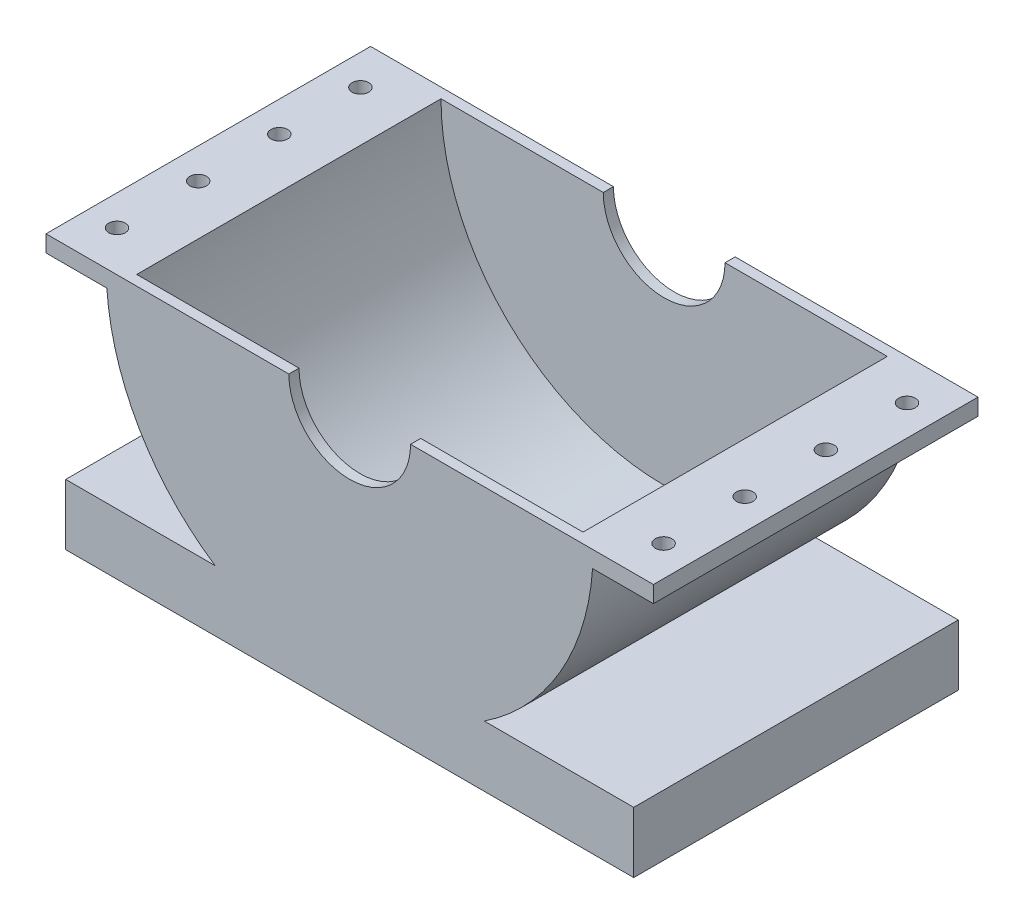
ISO-10303-21;
HEADER;
FILE_DESCRIPTION(('STEP AP214'),'2;1');
FILE_NAME('part.step','',(''),(''),'','','');
FILE_SCHEMA(('AUTOMOTIVE_DESIGN { 1 0 10303 214 1 1 1 1 }'));
ENDSEC;
DATA;
#1=APPLICATION_CONTEXT('core data for automotive mechanical design processes');
#2=APPLICATION_PROTOCOL_DEFINITION('international standard','automotive_design',2000,#1);
#3=PRODUCT_CONTEXT('',#1,'mechanical');
#4=PRODUCT('Part','Part','',(#3));
#5=PRODUCT_RELATED_PRODUCT_CATEGORY('part','',(#4));
#6=PRODUCT_DEFINITION_FORMATION('','',#4);
#7=PRODUCT_DEFINITION_CONTEXT('part definition',#1,'design');
#8=PRODUCT_DEFINITION('design','',#6,#7);
#9=PRODUCT_DEFINITION_SHAPE('','',#8);
#10=(LENGTH_UNIT() NAMED_UNIT(*) SI_UNIT(.MILLI.,.METRE.));
#11=(NAMED_UNIT(*) PLANE_ANGLE_UNIT() SI_UNIT($,.RADIAN.));
#12=(NAMED_UNIT(*) SI_UNIT($,.STERADIAN.) SOLID_ANGLE_UNIT());
#13=UNCERTAINTY_MEASURE_WITH_UNIT(LENGTH_MEASURE(1.E-05),#10,'distance_accuracy_value','');
#14=(GEOMETRIC_REPRESENTATION_CONTEXT(3) GLOBAL_UNCERTAINTY_ASSIGNED_CONTEXT((#13)) GLOBAL_UNIT_ASSIGNED_CONTEXT((#10,
#11,#12)) REPRESENTATION_CONTEXT('',''));
#15=CARTESIAN_POINT('',(0.,0.,0.));
#16=DIRECTION('',(0.,0.,1.));
#17=DIRECTION('',(1.,0.,0.));
#18=AXIS2_PLACEMENT_3D('',#15,#16,#17);
#19=CARTESIAN_POINT('',(-1.5,0.,4.));
#20=DIRECTION('',(0.,-1.,0.));
#21=DIRECTION('',(1.,0.,0.));
#22=AXIS2_PLACEMENT_3D('',#19,#20,#21);
#23=PLANE('',#22);
#24=CARTESIAN_POINT('',(-6.73597527559211,0.,1.));
#25=DIRECTION('',(0.,1.,0.));
#26=DIRECTION('',(0.,0.,1.));
#27=AXIS2_PLACEMENT_3D('',#24,#25,#26);
#28=CIRCLE('',#27,0.204999999999988);
#29=CARTESIAN_POINT('',(-6.73597527559211,0.,1.20499999999999));
#30=VERTEX_POINT('',#29);
#31=EDGE_CURVE('E468',#30,#30,#28,.T.);
#32=ORIENTED_EDGE('',*,*,#31,.F.);
#33=EDGE_LOOP('',(#32));
#34=FACE_BOUND('',#33,.T.);
#35=CARTESIAN_POINT('',(-6.73597527559211,0.,-1.));
#36=DIRECTION('',(0.,1.,0.));
#37=DIRECTION('',(0.,0.,1.));
#38=AXIS2_PLACEMENT_3D('',#35,#36,#37);
#39=CIRCLE('',#38,0.204999999999988);
#40=CARTESIAN_POINT('',(-6.73597527559211,0.,-0.795000000000012));
#41=VERTEX_POINT('',#40);
#42=EDGE_CURVE('E464',#41,#41,#39,.T.);
#43=ORIENTED_EDGE('',*,*,#42,.F.);
#44=EDGE_LOOP('',(#43));
#45=FACE_BOUND('',#44,.T.);
#46=CARTESIAN_POINT('',(-6.73597527559211,0.,-3.));
#47=DIRECTION('',(0.,1.,0.));
#48=DIRECTION('',(0.,0.,1.));
#49=AXIS2_PLACEMENT_3D('',#46,#47,#48);
#50=CIRCLE('',#49,0.204999999999988);
#51=CARTESIAN_POINT('',(-6.73597527559211,0.,-2.79500000000001));
#52=VERTEX_POINT('',#51);
#53=EDGE_CURVE('E460',#52,#52,#50,.T.);
#54=ORIENTED_EDGE('',*,*,#53,.F.);
#55=EDGE_LOOP('',(#54));
#56=FACE_BOUND('',#55,.T.);
#57=DIRECTION('',(0.,0.,-1.));
#58=VECTOR('',#57,1.);
#59=CARTESIAN_POINT('',(-1.5,0.,4.));
#60=LINE('',#59,#58);
#61=CARTESIAN_POINT('',(-1.5,0.,4.));
#62=VERTEX_POINT('',#61);
#63=CARTESIAN_POINT('',(-1.5,0.,3.75));
#64=VERTEX_POINT('',#63);
#65=EDGE_CURVE('E242',#62,#64,#60,.T.);
#66=ORIENTED_EDGE('',*,*,#65,.T.);
#67=DIRECTION('',(-1.,0.,0.));
#68=VECTOR('',#67,1.);
#69=CARTESIAN_POINT('',(-1.5,0.,3.75));
#70=LINE('',#69,#68);
#71=CARTESIAN_POINT('',(-5.5,0.,3.75));
#72=VERTEX_POINT('',#71);
#73=EDGE_CURVE('E431',#64,#72,#70,.T.);
#74=ORIENTED_EDGE('',*,*,#73,.T.);
#75=DIRECTION('',(0.,0.,-1.));
#76=VECTOR('',#75,1.);
#77=CARTESIAN_POINT('',(-5.5,0.,3.75));
#78=LINE('',#77,#76);
#79=CARTESIAN_POINT('',(-5.5,0.,-3.75));
#80=VERTEX_POINT('',#79);
#81=EDGE_CURVE('E183',#80,#72,#78,.F.);
#82=ORIENTED_EDGE('',*,*,#81,.F.);
#83=DIRECTION('',(-1.,0.,0.));
#84=VECTOR('',#83,1.);
#85=CARTESIAN_POINT('',(-1.5,0.,-3.75));
#86=LINE('',#85,#84);
#87=CARTESIAN_POINT('',(-1.5,0.,-3.75));
#88=VERTEX_POINT('',#87);
#89=EDGE_CURVE('E425',#88,#80,#86,.T.);
#90=ORIENTED_EDGE('',*,*,#89,.F.);
#91=CARTESIAN_POINT('',(-1.5,0.,-4.));
#92=VERTEX_POINT('',#91);
#93=EDGE_CURVE('E241',#88,#92,#60,.T.);
#94=ORIENTED_EDGE('',*,*,#93,.T.);
#95=DIRECTION('',(-1.,0.,0.));
#96=VECTOR('',#95,1.);
#97=CARTESIAN_POINT('',(-1.5,0.,-4.));
#98=LINE('',#97,#96);
#99=CARTESIAN_POINT('',(-7.48597527559211,0.,-4.));
#100=VERTEX_POINT('',#99);
#101=EDGE_CURVE('E182',#92,#100,#98,.T.);
#102=ORIENTED_EDGE('',*,*,#101,.T.);
#103=DIRECTION('',(0.,0.,-1.));
#104=VECTOR('',#103,1.);
#105=CARTESIAN_POINT('',(-7.48597527559211,0.,4.));
#106=LINE('',#105,#104);
#107=CARTESIAN_POINT('',(-7.48597527559211,0.,4.));
#108=VERTEX_POINT('',#107);
#109=EDGE_CURVE('E238',#108,#100,#106,.T.);
#110=ORIENTED_EDGE('',*,*,#109,.F.);
#111=DIRECTION('',(-1.,0.,0.));
#112=VECTOR('',#111,1.);
#113=CARTESIAN_POINT('',(-1.5,0.,4.));
#114=LINE('',#113,#112);
#115=EDGE_CURVE('E118',#62,#108,#114,.T.);
#116=ORIENTED_EDGE('',*,*,#115,.F.);
#117=EDGE_LOOP('',(#66,#74,#82,#90,#94,#102,#110,#116));
#118=FACE_BOUND('',#117,.T.);
#119=CARTESIAN_POINT('',(-6.73597527559211,0.,3.));
#120=DIRECTION('',(0.,1.,0.));
#121=DIRECTION('',(0.,0.,1.));
#122=AXIS2_PLACEMENT_3D('',#119,#120,#121);
#123=CIRCLE('',#122,0.204999999999988);
#124=CARTESIAN_POINT('',(-6.73597527559211,0.,3.20499999999999));
#125=VERTEX_POINT('',#124);
#126=EDGE_CURVE('E472',#125,#125,#123,.T.);
#127=ORIENTED_EDGE('',*,*,#126,.F.);
#128=EDGE_LOOP('',(#127));
#129=FACE_BOUND('',#128,.T.);
#130=ADVANCED_FACE('F33',(#34,#45,#56,#118,#129),#23,.F.);
#131=CARTESIAN_POINT('',(6.73597527559211,0.,3.));
#132=DIRECTION('',(0.,1.,0.));
#133=DIRECTION('',(0.,0.,1.));
#134=AXIS2_PLACEMENT_3D('',#131,#132,#133);
#135=CYLINDRICAL_SURFACE('',#134,0.204999999999994);
#136=CARTESIAN_POINT('',(6.73597527559211,-0.410000000000001,3.));
#137=DIRECTION('',(0.,1.,0.));
#138=DIRECTION('',(-1.,0.,0.));
#139=AXIS2_PLACEMENT_3D('',#136,#137,#138);
#140=CIRCLE('',#139,0.204999999999994);
#141=CARTESIAN_POINT('',(6.53097527559211,-0.410000000000001,3.));
#142=VERTEX_POINT('',#141);
#143=EDGE_CURVE('E41',#142,#142,#140,.T.);
#144=ORIENTED_EDGE('',*,*,#143,.F.);
#145=EDGE_LOOP('',(#144));
#146=FACE_BOUND('',#145,.T.);
#147=CARTESIAN_POINT('',(6.73597527559211,0.,3.));
#148=DIRECTION('',(0.,1.,0.));
#149=DIRECTION('',(0.,0.,1.));
#150=AXIS2_PLACEMENT_3D('',#147,#148,#149);
#151=CIRCLE('',#150,0.204999999999988);
#152=CARTESIAN_POINT('',(6.73597527559211,0.,3.20499999999999));
#153=VERTEX_POINT('',#152);
#154=EDGE_CURVE('E11',#153,#153,#151,.T.);
#155=ORIENTED_EDGE('',*,*,#154,.T.);
#156=EDGE_LOOP('',(#155));
#157=FACE_BOUND('',#156,.T.);
#158=ADVANCED_FACE('F35',(#146,#157),#135,.F.);
#159=CARTESIAN_POINT('',(6.73597527559211,0.,1.));
#160=DIRECTION('',(0.,1.,0.));
#161=DIRECTION('',(0.,0.,1.));
#162=AXIS2_PLACEMENT_3D('',#159,#160,#161);
#163=CYLINDRICAL_SURFACE('',#162,0.204999999999994);
#164=CARTESIAN_POINT('',(6.73597527559211,-0.410000000000001,1.));
#165=DIRECTION('',(0.,1.,0.));
#166=DIRECTION('',(-1.,0.,0.));
#167=AXIS2_PLACEMENT_3D('',#164,#165,#166);
#168=CIRCLE('',#167,0.204999999999994);
#169=CARTESIAN_POINT('',(6.53097527559211,-0.410000000000001,1.));
#170=VERTEX_POINT('',#169);
#171=EDGE_CURVE('E251',#170,#170,#168,.T.);
#172=ORIENTED_EDGE('',*,*,#171,.F.);
#173=EDGE_LOOP('',(#172));
#174=FACE_BOUND('',#173,.T.);
#175=CARTESIAN_POINT('',(6.73597527559211,0.,1.));
#176=DIRECTION('',(0.,1.,0.));
#177=DIRECTION('',(0.,0.,1.));
#178=AXIS2_PLACEMENT_3D('',#175,#176,#177);
#179=CIRCLE('',#178,0.204999999999988);
#180=CARTESIAN_POINT('',(6.73597527559211,0.,1.20499999999999));
#181=VERTEX_POINT('',#180);
#182=EDGE_CURVE('E254',#181,#181,#179,.T.);
#183=ORIENTED_EDGE('',*,*,#182,.T.);
#184=EDGE_LOOP('',(#183));
#185=FACE_BOUND('',#184,.T.);
#186=ADVANCED_FACE('F262',(#174,#185),#163,.F.);
#187=CARTESIAN_POINT('',(0.,0.,4.));
#188=DIRECTION('',(0.,0.,-1.));
#189=DIRECTION('',(-1.,0.,0.));
#190=AXIS2_PLACEMENT_3D('',#187,#188,#189);
#191=CYLINDRICAL_SURFACE('',#190,1.5);
#192=CARTESIAN_POINT('',(0.,0.,-3.75));
#193=DIRECTION('',(0.,0.,1.));
#194=DIRECTION('',(1.,0.,0.));
#195=AXIS2_PLACEMENT_3D('',#192,#193,#194);
#196=CIRCLE('',#195,1.5);
#197=CARTESIAN_POINT('',(1.5,0.,-3.75));
#198=VERTEX_POINT('',#197);
#199=EDGE_CURVE('E419',#198,#88,#196,.F.);
#200=ORIENTED_EDGE('',*,*,#199,.F.);
#201=DIRECTION('',(0.,0.,-1.));
#202=VECTOR('',#201,1.);
#203=CARTESIAN_POINT('',(1.5,0.,4.));
#204=LINE('',#203,#202);
#205=CARTESIAN_POINT('',(1.5,0.,-4.));
#206=VERTEX_POINT('',#205);
#207=EDGE_CURVE('E109',#198,#206,#204,.T.);
#208=ORIENTED_EDGE('',*,*,#207,.T.);
#209=CARTESIAN_POINT('',(0.,0.,-4.));
#210=DIRECTION('',(0.,0.,-1.));
#211=DIRECTION('',(1.,0.,0.));
#212=AXIS2_PLACEMENT_3D('',#209,#210,#211);
#213=CIRCLE('',#212,1.5);
#214=EDGE_CURVE('E180',#206,#92,#213,.T.);
#215=ORIENTED_EDGE('',*,*,#214,.T.);
#216=ORIENTED_EDGE('',*,*,#93,.F.);
#217=EDGE_LOOP('',(#200,#208,#215,#216));
#218=FACE_BOUND('',#217,.T.);
#219=ADVANCED_FACE('F292',(#218),#191,.F.);
#220=CARTESIAN_POINT('',(1.5,0.,4.));
#221=VERTEX_POINT('',#220);
#222=CARTESIAN_POINT('',(1.5,0.,3.75));
#223=VERTEX_POINT('',#222);
#224=EDGE_CURVE('E209',#221,#223,#204,.T.);
#225=ORIENTED_EDGE('',*,*,#224,.T.);
#226=CARTESIAN_POINT('',(0.,0.,3.75));
#227=DIRECTION('',(0.,0.,1.));
#228=DIRECTION('',(1.,0.,0.));
#229=AXIS2_PLACEMENT_3D('',#226,#227,#228);
#230=CIRCLE('',#229,1.5);
#231=EDGE_CURVE('E429',#223,#64,#230,.F.);
#232=ORIENTED_EDGE('',*,*,#231,.T.);
#233=ORIENTED_EDGE('',*,*,#65,.F.);
#234=CARTESIAN_POINT('',(0.,0.,4.));
#235=DIRECTION('',(0.,0.,-1.));
#236=DIRECTION('',(1.,0.,0.));
#237=AXIS2_PLACEMENT_3D('',#234,#235,#236);
#238=CIRCLE('',#237,1.5);
#239=EDGE_CURVE('E208',#221,#62,#238,.T.);
#240=ORIENTED_EDGE('',*,*,#239,.F.);
#241=EDGE_LOOP('',(#225,#232,#233,#240));
#242=FACE_BOUND('',#241,.T.);
#243=ADVANCED_FACE('F290',(#242),#191,.F.);
#244=CARTESIAN_POINT('',(-7.48597527559211,0.,4.));
#245=DIRECTION('',(1.,0.,0.));
#246=DIRECTION('',(0.,0.,-1.));
#247=AXIS2_PLACEMENT_3D('',#244,#245,#246);
#248=PLANE('',#247);
#249=DIRECTION('',(0.,-1.,0.));
#250=VECTOR('',#249,1.);
#251=CARTESIAN_POINT('',(-7.48597527559211,0.,-4.));
#252=LINE('',#251,#250);
#253=CARTESIAN_POINT('',(-7.48597527559211,-0.410000000000001,-4.));
#254=VERTEX_POINT('',#253);
#255=EDGE_CURVE('E185',#100,#254,#252,.T.);
#256=ORIENTED_EDGE('',*,*,#255,.T.);
#257=DIRECTION('',(0.,0.,-1.));
#258=VECTOR('',#257,1.);
#259=CARTESIAN_POINT('',(-7.48597527559211,-0.410000000000001,4.));
#260=LINE('',#259,#258);
#261=CARTESIAN_POINT('',(-7.48597527559211,-0.410000000000001,4.));
#262=VERTEX_POINT('',#261);
#263=EDGE_CURVE('E235',#262,#254,#260,.T.);
#264=ORIENTED_EDGE('',*,*,#263,.F.);
#265=DIRECTION('',(0.,-1.,0.));
#266=VECTOR('',#265,1.);
#267=CARTESIAN_POINT('',(-7.48597527559211,0.,4.));
#268=LINE('',#267,#266);
#269=EDGE_CURVE('E406',#108,#262,#268,.T.);
#270=ORIENTED_EDGE('',*,*,#269,.F.);
#271=ORIENTED_EDGE('',*,*,#109,.T.);
#272=EDGE_LOOP('',(#256,#264,#270,#271));
#273=FACE_BOUND('',#272,.T.);
#274=ADVANCED_FACE('F288',(#273),#248,.F.);
#275=CARTESIAN_POINT('',(-7.48597527559211,-0.410000000000001,4.));
#276=DIRECTION('',(0.,1.,0.));
#277=DIRECTION('',(-1.,0.,0.));
#278=AXIS2_PLACEMENT_3D('',#275,#276,#277);
#279=PLANE('',#278);
#280=CARTESIAN_POINT('',(-6.73597527559211,-0.410000000000001,3.));
#281=DIRECTION('',(0.,1.,0.));
#282=DIRECTION('',(-1.,0.,0.));
#283=AXIS2_PLACEMENT_3D('',#280,#281,#282);
#284=CIRCLE('',#283,0.204999999999994);
#285=CARTESIAN_POINT('',(-6.9409752755921,-0.410000000000001,3.));
#286=VERTEX_POINT('',#285);
#287=EDGE_CURVE('E348',#286,#286,#284,.T.);
#288=ORIENTED_EDGE('',*,*,#287,.T.);
#289=EDGE_LOOP('',(#288));
#290=FACE_BOUND('',#289,.T.);
#291=CARTESIAN_POINT('',(-6.73597527559211,-0.410000000000001,1.));
#292=DIRECTION('',(0.,1.,0.));
#293=DIRECTION('',(-1.,0.,0.));
#294=AXIS2_PLACEMENT_3D('',#291,#292,#293);
#295=CIRCLE('',#294,0.204999999999994);
#296=CARTESIAN_POINT('',(-6.9409752755921,-0.410000000000001,1.));
#297=VERTEX_POINT('',#296);
#298=EDGE_CURVE('E352',#297,#297,#295,.T.);
#299=ORIENTED_EDGE('',*,*,#298,.T.);
#300=EDGE_LOOP('',(#299));
#301=FACE_BOUND('',#300,.T.);
#302=CARTESIAN_POINT('',(-6.73597527559211,-0.410000000000001,-1.));
#303=DIRECTION('',(0.,1.,0.));
#304=DIRECTION('',(-1.,0.,0.));
#305=AXIS2_PLACEMENT_3D('',#302,#303,#304);
#306=CIRCLE('',#305,0.204999999999994);
#307=CARTESIAN_POINT('',(-6.9409752755921,-0.410000000000001,-1.));
#308=VERTEX_POINT('',#307);
#309=EDGE_CURVE('E356',#308,#308,#306,.T.);
#310=ORIENTED_EDGE('',*,*,#309,.T.);
#311=EDGE_LOOP('',(#310));
#312=FACE_BOUND('',#311,.T.);
#313=CARTESIAN_POINT('',(-6.73597527559211,-0.410000000000001,-3.));
#314=DIRECTION('',(0.,1.,0.));
#315=DIRECTION('',(-1.,0.,0.));
#316=AXIS2_PLACEMENT_3D('',#313,#314,#315);
#317=CIRCLE('',#316,0.204999999999994);
#318=CARTESIAN_POINT('',(-6.9409752755921,-0.410000000000001,-3.));
#319=VERTEX_POINT('',#318);
#320=EDGE_CURVE('E360',#319,#319,#317,.T.);
#321=ORIENTED_EDGE('',*,*,#320,.T.);
#322=EDGE_LOOP('',(#321));
#323=FACE_BOUND('',#322,.T.);
#324=DIRECTION('',(1.,0.,0.));
#325=VECTOR('',#324,1.);
#326=CARTESIAN_POINT('',(-7.48597527559211,-0.410000000000001,-4.));
#327=LINE('',#326,#325);
#328=CARTESIAN_POINT('',(-5.98597527559211,-0.410000000000001,-4.));
#329=VERTEX_POINT('',#328);
#330=EDGE_CURVE('E187',#254,#329,#327,.T.);
#331=ORIENTED_EDGE('',*,*,#330,.T.);
#332=DIRECTION('',(0.,0.,-1.));
#333=VECTOR('',#332,1.);
#334=CARTESIAN_POINT('',(-5.98597527559211,-0.410000000000001,4.));
#335=LINE('',#334,#333);
#336=CARTESIAN_POINT('',(-5.98597527559211,-0.410000000000001,4.));
#337=VERTEX_POINT('',#336);
#338=EDGE_CURVE('E232',#337,#329,#335,.T.);
#339=ORIENTED_EDGE('',*,*,#338,.F.);
#340=DIRECTION('',(1.,0.,0.));
#341=VECTOR('',#340,1.);
#342=CARTESIAN_POINT('',(-7.48597527559211,-0.410000000000001,4.));
#343=LINE('',#342,#341);
#344=EDGE_CURVE('E412',#262,#337,#343,.T.);
#345=ORIENTED_EDGE('',*,*,#344,.F.);
#346=ORIENTED_EDGE('',*,*,#263,.T.);
#347=EDGE_LOOP('',(#331,#339,#345,#346));
#348=FACE_BOUND('',#347,.T.);
#349=ADVANCED_FACE('F337',(#290,#301,#312,#323,#348),#279,.F.);
#350=CARTESIAN_POINT('',(0.,0.,4.));
#351=DIRECTION('',(0.,0.,-1.));
#352=DIRECTION('',(-1.,0.,0.));
#353=AXIS2_PLACEMENT_3D('',#350,#351,#352);
#354=CYLINDRICAL_SURFACE('',#353,6.);
#355=CARTESIAN_POINT('',(0.,0.,-4.));
#356=DIRECTION('',(0.,0.,1.));
#357=DIRECTION('',(1.,0.,0.));
#358=AXIS2_PLACEMENT_3D('',#355,#356,#357);
#359=CIRCLE('',#358,6.);
#360=CARTESIAN_POINT('',(-3.3166247903554,-5.,-4.));
#361=VERTEX_POINT('',#360);
#362=EDGE_CURVE('E189',#329,#361,#359,.T.);
#363=ORIENTED_EDGE('',*,*,#362,.T.);
#364=DIRECTION('',(0.,0.,-1.));
#365=VECTOR('',#364,1.);
#366=CARTESIAN_POINT('',(-3.3166247903554,-5.,4.));
#367=LINE('',#366,#365);
#368=CARTESIAN_POINT('',(-3.3166247903554,-5.,4.));
#369=VERTEX_POINT('',#368);
#370=EDGE_CURVE('E229',#369,#361,#367,.T.);
#371=ORIENTED_EDGE('',*,*,#370,.F.);
#372=CARTESIAN_POINT('',(0.,0.,4.));
#373=DIRECTION('',(0.,0.,1.));
#374=DIRECTION('',(1.,0.,0.));
#375=AXIS2_PLACEMENT_3D('',#372,#373,#374);
#376=CIRCLE('',#375,6.);
#377=EDGE_CURVE('E370',#337,#369,#376,.T.);
#378=ORIENTED_EDGE('',*,*,#377,.F.);
#379=ORIENTED_EDGE('',*,*,#338,.T.);
#380=EDGE_LOOP('',(#363,#371,#378,#379));
#381=FACE_BOUND('',#380,.T.);
#382=ADVANCED_FACE('F334',(#381),#354,.T.);
#383=CARTESIAN_POINT('',(-7.,-5.,4.));
#384=DIRECTION('',(0.,-1.,0.));
#385=DIRECTION('',(0.,0.,-1.));
#386=AXIS2_PLACEMENT_3D('',#383,#384,#385);
#387=PLANE('',#386);
#388=DIRECTION('',(-1.,0.,0.));
#389=VECTOR('',#388,1.);
#390=CARTESIAN_POINT('',(-7.,-5.,-4.));
#391=LINE('',#390,#389);
#392=CARTESIAN_POINT('',(-7.,-5.,-4.));
#393=VERTEX_POINT('',#392);
#394=EDGE_CURVE('E191',#361,#393,#391,.T.);
#395=ORIENTED_EDGE('',*,*,#394,.T.);
#396=DIRECTION('',(0.,0.,-1.));
#397=VECTOR('',#396,1.);
#398=CARTESIAN_POINT('',(-7.,-5.,4.));
#399=LINE('',#398,#397);
#400=CARTESIAN_POINT('',(-7.,-5.,4.));
#401=VERTEX_POINT('',#400);
#402=EDGE_CURVE('E226',#401,#393,#399,.T.);
#403=ORIENTED_EDGE('',*,*,#402,.F.);
#404=DIRECTION('',(-1.,0.,0.));
#405=VECTOR('',#404,1.);
#406=CARTESIAN_POINT('',(-7.,-5.,4.));
#407=LINE('',#406,#405);
#408=EDGE_CURVE('E382',#369,#401,#407,.T.);
#409=ORIENTED_EDGE('',*,*,#408,.F.);
#410=ORIENTED_EDGE('',*,*,#370,.T.);
#411=EDGE_LOOP('',(#395,#403,#409,#410));
#412=FACE_BOUND('',#411,.T.);
#413=ADVANCED_FACE('F330',(#412),#387,.F.);
#414=CARTESIAN_POINT('',(-7.,-6.5,4.));
#415=DIRECTION('',(1.,0.,0.));
#416=DIRECTION('',(0.,0.,-1.));
#417=AXIS2_PLACEMENT_3D('',#414,#415,#416);
#418=PLANE('',#417);
#419=DIRECTION('',(0.,-1.,0.));
#420=VECTOR('',#419,1.);
#421=CARTESIAN_POINT('',(-7.,-6.5,-4.));
#422=LINE('',#421,#420);
#423=CARTESIAN_POINT('',(-7.,-6.5,-4.));
#424=VERTEX_POINT('',#423);
#425=EDGE_CURVE('E193',#393,#424,#422,.T.);
#426=ORIENTED_EDGE('',*,*,#425,.T.);
#427=DIRECTION('',(0.,0.,-1.));
#428=VECTOR('',#427,1.);
#429=CARTESIAN_POINT('',(-7.,-6.5,4.));
#430=LINE('',#429,#428);
#431=CARTESIAN_POINT('',(-7.,-6.5,4.));
#432=VERTEX_POINT('',#431);
#433=EDGE_CURVE('E223',#432,#424,#430,.T.);
#434=ORIENTED_EDGE('',*,*,#433,.F.);
#435=DIRECTION('',(0.,-1.,0.));
#436=VECTOR('',#435,1.);
#437=CARTESIAN_POINT('',(-7.,-6.5,4.));
#438=LINE('',#437,#436);
#439=EDGE_CURVE('E379',#401,#432,#438,.T.);
#440=ORIENTED_EDGE('',*,*,#439,.F.);
#441=ORIENTED_EDGE('',*,*,#402,.T.);
#442=EDGE_LOOP('',(#426,#434,#440,#441));
#443=FACE_BOUND('',#442,.T.);
#444=ADVANCED_FACE('F326',(#443),#418,.F.);
#445=CARTESIAN_POINT('',(-7.,-6.5,4.));
#446=DIRECTION('',(0.,1.,0.));
#447=DIRECTION('',(-1.,0.,0.));
#448=AXIS2_PLACEMENT_3D('',#445,#446,#447);
#449=PLANE('',#448);
#450=DIRECTION('',(1.,0.,0.));
#451=VECTOR('',#450,1.);
#452=CARTESIAN_POINT('',(-7.,-6.5,-4.));
#453=LINE('',#452,#451);
#454=CARTESIAN_POINT('',(7.,-6.5,-4.));
#455=VERTEX_POINT('',#454);
#456=EDGE_CURVE('E195',#424,#455,#453,.T.);
#457=ORIENTED_EDGE('',*,*,#456,.T.);
#458=DIRECTION('',(0.,0.,-1.));
#459=VECTOR('',#458,1.);
#460=CARTESIAN_POINT('',(7.,-6.5,4.));
#461=LINE('',#460,#459);
#462=CARTESIAN_POINT('',(7.,-6.5,4.));
#463=VERTEX_POINT('',#462);
#464=EDGE_CURVE('E220',#463,#455,#461,.T.);
#465=ORIENTED_EDGE('',*,*,#464,.F.);
#466=DIRECTION('',(1.,0.,0.));
#467=VECTOR('',#466,1.);
#468=CARTESIAN_POINT('',(-7.,-6.5,4.));
#469=LINE('',#468,#467);
#470=EDGE_CURVE('E381',#432,#463,#469,.T.);
#471=ORIENTED_EDGE('',*,*,#470,.F.);
#472=ORIENTED_EDGE('',*,*,#433,.T.);
#473=EDGE_LOOP('',(#457,#465,#471,#472));
#474=FACE_BOUND('',#473,.T.);
#475=ADVANCED_FACE('F322',(#474),#449,.F.);
#476=CARTESIAN_POINT('',(7.,-6.5,4.));
#477=DIRECTION('',(-1.,0.,0.));
#478=DIRECTION('',(0.,-1.,0.));
#479=AXIS2_PLACEMENT_3D('',#476,#477,#478);
#480=PLANE('',#479);
#481=DIRECTION('',(0.,1.,0.));
#482=VECTOR('',#481,1.);
#483=CARTESIAN_POINT('',(7.,-6.5,-4.));
#484=LINE('',#483,#482);
#485=CARTESIAN_POINT('',(7.,-5.,-4.));
#486=VERTEX_POINT('',#485);
#487=EDGE_CURVE('E197',#455,#486,#484,.T.);
#488=ORIENTED_EDGE('',*,*,#487,.T.);
#489=DIRECTION('',(0.,0.,-1.));
#490=VECTOR('',#489,1.);
#491=CARTESIAN_POINT('',(7.,-5.,4.));
#492=LINE('',#491,#490);
#493=CARTESIAN_POINT('',(7.,-5.,4.));
#494=VERTEX_POINT('',#493);
#495=EDGE_CURVE('E217',#494,#486,#492,.T.);
#496=ORIENTED_EDGE('',*,*,#495,.F.);
#497=DIRECTION('',(0.,1.,0.));
#498=VECTOR('',#497,1.);
#499=CARTESIAN_POINT('',(7.,-6.5,4.));
#500=LINE('',#499,#498);
#501=EDGE_CURVE('E384',#463,#494,#500,.T.);
#502=ORIENTED_EDGE('',*,*,#501,.F.);
#503=ORIENTED_EDGE('',*,*,#464,.T.);
#504=EDGE_LOOP('',(#488,#496,#502,#503));
#505=FACE_BOUND('',#504,.T.);
#506=ADVANCED_FACE('F318',(#505),#480,.F.);
#507=CARTESIAN_POINT('',(7.,-5.,4.));
#508=DIRECTION('',(0.,-1.,0.));
#509=DIRECTION('',(0.,0.,-1.));
#510=AXIS2_PLACEMENT_3D('',#507,#508,#509);
#511=PLANE('',#510);
#512=DIRECTION('',(-1.,0.,0.));
#513=VECTOR('',#512,1.);
#514=CARTESIAN_POINT('',(7.,-5.,-4.));
#515=LINE('',#514,#513);
#516=CARTESIAN_POINT('',(3.3166247903554,-5.,-4.));
#517=VERTEX_POINT('',#516);
#518=EDGE_CURVE('E199',#486,#517,#515,.T.);
#519=ORIENTED_EDGE('',*,*,#518,.T.);
#520=DIRECTION('',(0.,0.,-1.));
#521=VECTOR('',#520,1.);
#522=CARTESIAN_POINT('',(3.3166247903554,-5.,4.));
#523=LINE('',#522,#521);
#524=CARTESIAN_POINT('',(3.3166247903554,-5.,4.));
#525=VERTEX_POINT('',#524);
#526=EDGE_CURVE('E214',#525,#517,#523,.T.);
#527=ORIENTED_EDGE('',*,*,#526,.F.);
#528=DIRECTION('',(-1.,0.,0.));
#529=VECTOR('',#528,1.);
#530=CARTESIAN_POINT('',(7.,-5.,4.));
#531=LINE('',#530,#529);
#532=EDGE_CURVE('E390',#494,#525,#531,.T.);
#533=ORIENTED_EDGE('',*,*,#532,.F.);
#534=ORIENTED_EDGE('',*,*,#495,.T.);
#535=EDGE_LOOP('',(#519,#527,#533,#534));
#536=FACE_BOUND('',#535,.T.);
#537=ADVANCED_FACE('F310',(#536),#511,.F.);
#538=CARTESIAN_POINT('',(0.,0.,4.));
#539=DIRECTION('',(0.,0.,-1.));
#540=DIRECTION('',(-1.,0.,0.));
#541=AXIS2_PLACEMENT_3D('',#538,#539,#540);
#542=CYLINDRICAL_SURFACE('',#541,6.);
#543=CARTESIAN_POINT('',(0.,0.,-4.));
#544=DIRECTION('',(0.,0.,1.));
#545=DIRECTION('',(1.,0.,0.));
#546=AXIS2_PLACEMENT_3D('',#543,#544,#545);
#547=CIRCLE('',#546,6.);
#548=CARTESIAN_POINT('',(5.98597527559211,-0.410000000000001,-4.));
#549=VERTEX_POINT('',#548);
#550=EDGE_CURVE('E201',#517,#549,#547,.T.);
#551=ORIENTED_EDGE('',*,*,#550,.T.);
#552=DIRECTION('',(0.,0.,-1.));
#553=VECTOR('',#552,1.);
#554=CARTESIAN_POINT('',(5.98597527559211,-0.410000000000001,4.));
#555=LINE('',#554,#553);
#556=CARTESIAN_POINT('',(5.98597527559211,-0.410000000000001,4.));
#557=VERTEX_POINT('',#556);
#558=EDGE_CURVE('E171',#557,#549,#555,.T.);
#559=ORIENTED_EDGE('',*,*,#558,.F.);
#560=CARTESIAN_POINT('',(0.,0.,4.));
#561=DIRECTION('',(0.,0.,1.));
#562=DIRECTION('',(1.,0.,0.));
#563=AXIS2_PLACEMENT_3D('',#560,#561,#562);
#564=CIRCLE('',#563,6.);
#565=EDGE_CURVE('E158',#525,#557,#564,.T.);
#566=ORIENTED_EDGE('',*,*,#565,.F.);
#567=ORIENTED_EDGE('',*,*,#526,.T.);
#568=EDGE_LOOP('',(#551,#559,#566,#567));
#569=FACE_BOUND('',#568,.T.);
#570=ADVANCED_FACE('F304',(#569),#542,.T.);
#571=CARTESIAN_POINT('',(7.48597527559211,-0.410000000000001,4.));
#572=DIRECTION('',(0.,1.,0.));
#573=DIRECTION('',(-1.,0.,0.));
#574=AXIS2_PLACEMENT_3D('',#571,#572,#573);
#575=PLANE('',#574);
#576=CARTESIAN_POINT('',(6.73597527559211,-0.410000000000001,-1.));
#577=DIRECTION('',(0.,1.,0.));
#578=DIRECTION('',(-1.,0.,0.));
#579=AXIS2_PLACEMENT_3D('',#576,#577,#578);
#580=CIRCLE('',#579,0.204999999999994);
#581=CARTESIAN_POINT('',(6.53097527559211,-0.410000000000001,-1.));
#582=VERTEX_POINT('',#581);
#583=EDGE_CURVE('E457',#582,#582,#580,.T.);
#584=ORIENTED_EDGE('',*,*,#583,.T.);
#585=EDGE_LOOP('',(#584));
#586=FACE_BOUND('',#585,.T.);
#587=CARTESIAN_POINT('',(6.73597527559211,-0.410000000000001,-3.));
#588=DIRECTION('',(0.,1.,0.));
#589=DIRECTION('',(-1.,0.,0.));
#590=AXIS2_PLACEMENT_3D('',#587,#588,#589);
#591=CIRCLE('',#590,0.204999999999994);
#592=CARTESIAN_POINT('',(6.53097527559211,-0.410000000000001,-3.));
#593=VERTEX_POINT('',#592);
#594=EDGE_CURVE('E446',#593,#593,#591,.T.);
#595=ORIENTED_EDGE('',*,*,#594,.T.);
#596=EDGE_LOOP('',(#595));
#597=FACE_BOUND('',#596,.T.);
#598=DIRECTION('',(1.,0.,0.));
#599=VECTOR('',#598,1.);
#600=CARTESIAN_POINT('',(7.48597527559211,-0.410000000000001,-4.));
#601=LINE('',#600,#599);
#602=CARTESIAN_POINT('',(7.48597527559211,-0.410000000000001,-4.));
#603=VERTEX_POINT('',#602);
#604=EDGE_CURVE('E168',#549,#603,#601,.T.);
#605=ORIENTED_EDGE('',*,*,#604,.T.);
#606=DIRECTION('',(0.,0.,-1.));
#607=VECTOR('',#606,1.);
#608=CARTESIAN_POINT('',(7.48597527559211,-0.410000000000001,4.));
#609=LINE('',#608,#607);
#610=CARTESIAN_POINT('',(7.48597527559211,-0.410000000000001,4.));
#611=VERTEX_POINT('',#610);
#612=EDGE_CURVE('E164',#611,#603,#609,.T.);
#613=ORIENTED_EDGE('',*,*,#612,.F.);
#614=DIRECTION('',(1.,0.,0.));
#615=VECTOR('',#614,1.);
#616=CARTESIAN_POINT('',(7.48597527559211,-0.410000000000001,4.));
#617=LINE('',#616,#615);
#618=EDGE_CURVE('E151',#557,#611,#617,.T.);
#619=ORIENTED_EDGE('',*,*,#618,.F.);
#620=ORIENTED_EDGE('',*,*,#558,.T.);
#621=EDGE_LOOP('',(#605,#613,#619,#620));
#622=FACE_BOUND('',#621,.T.);
#623=ORIENTED_EDGE('',*,*,#171,.T.);
#624=EDGE_LOOP('',(#623));
#625=FACE_BOUND('',#624,.T.);
#626=ORIENTED_EDGE('',*,*,#143,.T.);
#627=EDGE_LOOP('',(#626));
#628=FACE_BOUND('',#627,.T.);
#629=ADVANCED_FACE('F165',(#586,#597,#622,#625,#628),#575,.F.);
#630=CARTESIAN_POINT('',(7.48597527559211,0.,4.));
#631=DIRECTION('',(-1.,0.,0.));
#632=DIRECTION('',(0.,0.,1.));
#633=AXIS2_PLACEMENT_3D('',#630,#631,#632);
#634=PLANE('',#633);
#635=DIRECTION('',(0.,1.,0.));
#636=VECTOR('',#635,1.);
#637=CARTESIAN_POINT('',(7.48597527559211,0.,-4.));
#638=LINE('',#637,#636);
#639=CARTESIAN_POINT('',(7.48597527559211,0.,-4.));
#640=VERTEX_POINT('',#639);
#641=EDGE_CURVE('E204',#603,#640,#638,.T.);
#642=ORIENTED_EDGE('',*,*,#641,.T.);
#643=DIRECTION('',(0.,0.,-1.));
#644=VECTOR('',#643,1.);
#645=CARTESIAN_POINT('',(7.48597527559211,0.,4.));
#646=LINE('',#645,#644);
#647=CARTESIAN_POINT('',(7.48597527559211,0.,4.));
#648=VERTEX_POINT('',#647);
#649=EDGE_CURVE('E172',#648,#640,#646,.T.);
#650=ORIENTED_EDGE('',*,*,#649,.F.);
#651=DIRECTION('',(0.,1.,0.));
#652=VECTOR('',#651,1.);
#653=CARTESIAN_POINT('',(7.48597527559211,0.,4.));
#654=LINE('',#653,#652);
#655=EDGE_CURVE('E155',#611,#648,#654,.T.);
#656=ORIENTED_EDGE('',*,*,#655,.F.);
#657=ORIENTED_EDGE('',*,*,#612,.T.);
#658=EDGE_LOOP('',(#642,#650,#656,#657));
#659=FACE_BOUND('',#658,.T.);
#660=ADVANCED_FACE('F174',(#659),#634,.F.);
#661=CARTESIAN_POINT('',(1.5,0.,4.));
#662=DIRECTION('',(0.,-1.,0.));
#663=DIRECTION('',(1.,0.,0.));
#664=AXIS2_PLACEMENT_3D('',#661,#662,#663);
#665=PLANE('',#664);
#666=CARTESIAN_POINT('',(6.73597527559211,0.,-1.));
#667=DIRECTION('',(0.,1.,0.));
#668=DIRECTION('',(0.,0.,1.));
#669=AXIS2_PLACEMENT_3D('',#666,#667,#668);
#670=CIRCLE('',#669,0.204999999999988);
#671=CARTESIAN_POINT('',(6.73597527559211,0.,-0.795000000000012));
#672=VERTEX_POINT('',#671);
#673=EDGE_CURVE('E454',#672,#672,#670,.T.);
#674=ORIENTED_EDGE('',*,*,#673,.F.);
#675=EDGE_LOOP('',(#674));
#676=FACE_BOUND('',#675,.T.);
#677=CARTESIAN_POINT('',(6.73597527559211,0.,-3.));
#678=DIRECTION('',(0.,1.,0.));
#679=DIRECTION('',(0.,0.,1.));
#680=AXIS2_PLACEMENT_3D('',#677,#678,#679);
#681=CIRCLE('',#680,0.204999999999988);
#682=CARTESIAN_POINT('',(6.73597527559211,0.,-2.79500000000001));
#683=VERTEX_POINT('',#682);
#684=EDGE_CURVE('E451',#683,#683,#681,.T.);
#685=ORIENTED_EDGE('',*,*,#684,.F.);
#686=EDGE_LOOP('',(#685));
#687=FACE_BOUND('',#686,.T.);
#688=DIRECTION('',(0.,0.,-1.));
#689=VECTOR('',#688,1.);
#690=CARTESIAN_POINT('',(5.5,0.,3.75));
#691=LINE('',#690,#689);
#692=CARTESIAN_POINT('',(5.5,0.,3.75));
#693=VERTEX_POINT('',#692);
#694=CARTESIAN_POINT('',(5.5,0.,-3.75));
#695=VERTEX_POINT('',#694);
#696=EDGE_CURVE('E246',#693,#695,#691,.T.);
#697=ORIENTED_EDGE('',*,*,#696,.F.);
#698=DIRECTION('',(-1.,0.,0.));
#699=VECTOR('',#698,1.);
#700=CARTESIAN_POINT('',(1.5,0.,3.75));
#701=LINE('',#700,#699);
#702=EDGE_CURVE('E248',#693,#223,#701,.T.);
#703=ORIENTED_EDGE('',*,*,#702,.T.);
#704=ORIENTED_EDGE('',*,*,#224,.F.);
#705=DIRECTION('',(-1.,0.,0.));
#706=VECTOR('',#705,1.);
#707=CARTESIAN_POINT('',(1.5,0.,4.));
#708=LINE('',#707,#706);
#709=EDGE_CURVE('E57',#648,#221,#708,.T.);
#710=ORIENTED_EDGE('',*,*,#709,.F.);
#711=ORIENTED_EDGE('',*,*,#649,.T.);
#712=DIRECTION('',(-1.,0.,0.));
#713=VECTOR('',#712,1.);
#714=CARTESIAN_POINT('',(1.5,0.,-4.));
#715=LINE('',#714,#713);
#716=EDGE_CURVE('E206',#640,#206,#715,.T.);
#717=ORIENTED_EDGE('',*,*,#716,.T.);
#718=ORIENTED_EDGE('',*,*,#207,.F.);
#719=DIRECTION('',(-1.,0.,0.));
#720=VECTOR('',#719,1.);
#721=CARTESIAN_POINT('',(1.5,0.,-3.75));
#722=LINE('',#721,#720);
#723=EDGE_CURVE('E244',#695,#198,#722,.T.);
#724=ORIENTED_EDGE('',*,*,#723,.F.);
#725=EDGE_LOOP('',(#697,#703,#704,#710,#711,#717,#718,#724));
#726=FACE_BOUND('',#725,.T.);
#727=ORIENTED_EDGE('',*,*,#182,.F.);
#728=EDGE_LOOP('',(#727));
#729=FACE_BOUND('',#728,.T.);
#730=ORIENTED_EDGE('',*,*,#154,.F.);
#731=EDGE_LOOP('',(#730));
#732=FACE_BOUND('',#731,.T.);
#733=ADVANCED_FACE('F265',(#676,#687,#726,#729,#732),#665,.F.);
#734=CARTESIAN_POINT('',(0.,0.,4.));
#735=DIRECTION('',(0.,0.,1.));
#736=DIRECTION('',(1.,0.,0.));
#737=AXIS2_PLACEMENT_3D('',#734,#735,#736);
#738=PLANE('',#737);
#739=ORIENTED_EDGE('',*,*,#239,.T.);
#740=ORIENTED_EDGE('',*,*,#115,.T.);
#741=ORIENTED_EDGE('',*,*,#269,.T.);
#742=ORIENTED_EDGE('',*,*,#344,.T.);
#743=ORIENTED_EDGE('',*,*,#377,.T.);
#744=ORIENTED_EDGE('',*,*,#408,.T.);
#745=ORIENTED_EDGE('',*,*,#439,.T.);
#746=ORIENTED_EDGE('',*,*,#470,.T.);
#747=ORIENTED_EDGE('',*,*,#501,.T.);
#748=ORIENTED_EDGE('',*,*,#532,.T.);
#749=ORIENTED_EDGE('',*,*,#565,.T.);
#750=ORIENTED_EDGE('',*,*,#618,.T.);
#751=ORIENTED_EDGE('',*,*,#655,.T.);
#752=ORIENTED_EDGE('',*,*,#709,.T.);
#753=EDGE_LOOP('',(#739,#740,#741,#742,#743,#744,#745,#746,#747,#748,#749,#750,#751,#752));
#754=FACE_BOUND('',#753,.T.);
#755=ADVANCED_FACE('F153',(#754),#738,.T.);
#756=CARTESIAN_POINT('',(0.,0.,-4.));
#757=DIRECTION('',(0.,0.,1.));
#758=DIRECTION('',(1.,0.,0.));
#759=AXIS2_PLACEMENT_3D('',#756,#757,#758);
#760=PLANE('',#759);
#761=ORIENTED_EDGE('',*,*,#214,.F.);
#762=ORIENTED_EDGE('',*,*,#716,.F.);
#763=ORIENTED_EDGE('',*,*,#641,.F.);
#764=ORIENTED_EDGE('',*,*,#604,.F.);
#765=ORIENTED_EDGE('',*,*,#550,.F.);
#766=ORIENTED_EDGE('',*,*,#518,.F.);
#767=ORIENTED_EDGE('',*,*,#487,.F.);
#768=ORIENTED_EDGE('',*,*,#456,.F.);
#769=ORIENTED_EDGE('',*,*,#425,.F.);
#770=ORIENTED_EDGE('',*,*,#394,.F.);
#771=ORIENTED_EDGE('',*,*,#362,.F.);
#772=ORIENTED_EDGE('',*,*,#330,.F.);
#773=ORIENTED_EDGE('',*,*,#255,.F.);
#774=ORIENTED_EDGE('',*,*,#101,.F.);
#775=EDGE_LOOP('',(#761,#762,#763,#764,#765,#766,#767,#768,#769,#770,#771,#772,#773,#774));
#776=FACE_BOUND('',#775,.T.);
#777=ADVANCED_FACE('F273',(#776),#760,.F.);
#778=CARTESIAN_POINT('',(0.,0.,3.75));
#779=DIRECTION('',(0.,0.,-1.));
#780=DIRECTION('',(-1.,0.,0.));
#781=AXIS2_PLACEMENT_3D('',#778,#779,#780);
#782=CYLINDRICAL_SURFACE('',#781,5.5);
#783=ORIENTED_EDGE('',*,*,#81,.T.);
#784=CARTESIAN_POINT('',(0.,0.,3.75));
#785=DIRECTION('',(0.,0.,1.));
#786=DIRECTION('',(1.,0.,0.));
#787=AXIS2_PLACEMENT_3D('',#784,#785,#786);
#788=CIRCLE('',#787,5.5);
#789=EDGE_CURVE('E433',#72,#693,#788,.T.);
#790=ORIENTED_EDGE('',*,*,#789,.T.);
#791=ORIENTED_EDGE('',*,*,#696,.T.);
#792=CARTESIAN_POINT('',(0.,0.,-3.75));
#793=DIRECTION('',(0.,0.,1.));
#794=DIRECTION('',(1.,0.,0.));
#795=AXIS2_PLACEMENT_3D('',#792,#793,#794);
#796=CIRCLE('',#795,5.5);
#797=EDGE_CURVE('E48',#80,#695,#796,.T.);
#798=ORIENTED_EDGE('',*,*,#797,.F.);
#799=EDGE_LOOP('',(#783,#790,#791,#798));
#800=FACE_BOUND('',#799,.T.);
#801=ADVANCED_FACE('F441',(#800),#782,.F.);
#802=CARTESIAN_POINT('',(0.,0.,3.75));
#803=DIRECTION('',(0.,0.,1.));
#804=DIRECTION('',(1.,0.,0.));
#805=AXIS2_PLACEMENT_3D('',#802,#803,#804);
#806=PLANE('',#805);
#807=ORIENTED_EDGE('',*,*,#231,.F.);
#808=ORIENTED_EDGE('',*,*,#702,.F.);
#809=ORIENTED_EDGE('',*,*,#789,.F.);
#810=ORIENTED_EDGE('',*,*,#73,.F.);
#811=EDGE_LOOP('',(#807,#808,#809,#810));
#812=FACE_BOUND('',#811,.T.);
#813=ADVANCED_FACE('F445',(#812),#806,.F.);
#814=CARTESIAN_POINT('',(0.,0.,-3.75));
#815=DIRECTION('',(0.,0.,1.));
#816=DIRECTION('',(1.,0.,0.));
#817=AXIS2_PLACEMENT_3D('',#814,#815,#816);
#818=PLANE('',#817);
#819=ORIENTED_EDGE('',*,*,#89,.T.);
#820=ORIENTED_EDGE('',*,*,#797,.T.);
#821=ORIENTED_EDGE('',*,*,#723,.T.);
#822=ORIENTED_EDGE('',*,*,#199,.T.);
#823=EDGE_LOOP('',(#819,#820,#821,#822));
#824=FACE_BOUND('',#823,.T.);
#825=ADVANCED_FACE('F502',(#824),#818,.T.);
#826=CARTESIAN_POINT('',(6.73597527559211,0.,-3.));
#827=DIRECTION('',(0.,1.,0.));
#828=DIRECTION('',(0.,0.,1.));
#829=AXIS2_PLACEMENT_3D('',#826,#827,#828);
#830=CYLINDRICAL_SURFACE('',#829,0.204999999999994);
#831=ORIENTED_EDGE('',*,*,#594,.F.);
#832=EDGE_LOOP('',(#831));
#833=FACE_BOUND('',#832,.T.);
#834=ORIENTED_EDGE('',*,*,#684,.T.);
#835=EDGE_LOOP('',(#834));
#836=FACE_BOUND('',#835,.T.);
#837=ADVANCED_FACE('F498',(#833,#836),#830,.F.);
#838=CARTESIAN_POINT('',(6.73597527559211,0.,-1.));
#839=DIRECTION('',(0.,1.,0.));
#840=DIRECTION('',(0.,0.,1.));
#841=AXIS2_PLACEMENT_3D('',#838,#839,#840);
#842=CYLINDRICAL_SURFACE('',#841,0.204999999999994);
#843=ORIENTED_EDGE('',*,*,#583,.F.);
#844=EDGE_LOOP('',(#843));
#845=FACE_BOUND('',#844,.T.);
#846=ORIENTED_EDGE('',*,*,#673,.T.);
#847=EDGE_LOOP('',(#846));
#848=FACE_BOUND('',#847,.T.);
#849=ADVANCED_FACE('F494',(#845,#848),#842,.F.);
#850=CARTESIAN_POINT('',(-6.73597527559211,0.,-3.));
#851=DIRECTION('',(0.,1.,0.));
#852=DIRECTION('',(0.,0.,1.));
#853=AXIS2_PLACEMENT_3D('',#850,#851,#852);
#854=CYLINDRICAL_SURFACE('',#853,0.204999999999994);
#855=ORIENTED_EDGE('',*,*,#320,.F.);
#856=EDGE_LOOP('',(#855));
#857=FACE_BOUND('',#856,.T.);
#858=ORIENTED_EDGE('',*,*,#53,.T.);
#859=EDGE_LOOP('',(#858));
#860=FACE_BOUND('',#859,.T.);
#861=ADVANCED_FACE('F490',(#857,#860),#854,.F.);
#862=CARTESIAN_POINT('',(-6.73597527559211,0.,-1.));
#863=DIRECTION('',(0.,1.,0.));
#864=DIRECTION('',(0.,0.,1.));
#865=AXIS2_PLACEMENT_3D('',#862,#863,#864);
#866=CYLINDRICAL_SURFACE('',#865,0.204999999999994);
#867=ORIENTED_EDGE('',*,*,#309,.F.);
#868=EDGE_LOOP('',(#867));
#869=FACE_BOUND('',#868,.T.);
#870=ORIENTED_EDGE('',*,*,#42,.T.);
#871=EDGE_LOOP('',(#870));
#872=FACE_BOUND('',#871,.T.);
#873=ADVANCED_FACE('F484',(#869,#872),#866,.F.);
#874=CARTESIAN_POINT('',(-6.73597527559211,0.,1.));
#875=DIRECTION('',(0.,1.,0.));
#876=DIRECTION('',(0.,0.,1.));
#877=AXIS2_PLACEMENT_3D('',#874,#875,#876);
#878=CYLINDRICAL_SURFACE('',#877,0.204999999999994);
#879=ORIENTED_EDGE('',*,*,#298,.F.);
#880=EDGE_LOOP('',(#879));
#881=FACE_BOUND('',#880,.T.);
#882=ORIENTED_EDGE('',*,*,#31,.T.);
#883=EDGE_LOOP('',(#882));
#884=FACE_BOUND('',#883,.T.);
#885=ADVANCED_FACE('F478',(#881,#884),#878,.F.);
#886=CARTESIAN_POINT('',(-6.73597527559211,0.,3.));
#887=DIRECTION('',(0.,1.,0.));
#888=DIRECTION('',(0.,0.,1.));
#889=AXIS2_PLACEMENT_3D('',#886,#887,#888);
#890=CYLINDRICAL_SURFACE('',#889,0.204999999999994);
#891=ORIENTED_EDGE('',*,*,#287,.F.);
#892=EDGE_LOOP('',(#891));
#893=FACE_BOUND('',#892,.T.);
#894=ORIENTED_EDGE('',*,*,#126,.T.);
#895=EDGE_LOOP('',(#894));
#896=FACE_BOUND('',#895,.T.);
#897=ADVANCED_FACE('F476',(#893,#896),#890,.F.);
#898=CLOSED_SHELL('',(#130,#158,#186,#219,#243,#274,#349,#382,#413,#444,#475,#506,#537,#570,
#629,#660,#733,#755,#777,#801,#813,#825,#837,#849,#861,#873,#885,#897));
#899=MANIFOLD_SOLID_BREP('B2',#898);
#900=ADVANCED_BREP_SHAPE_REPRESENTATION('',(#18,#899),#14);
#901=SHAPE_DEFINITION_REPRESENTATION(#9,#900);
ENDSEC;
END-ISO-10303-21;
